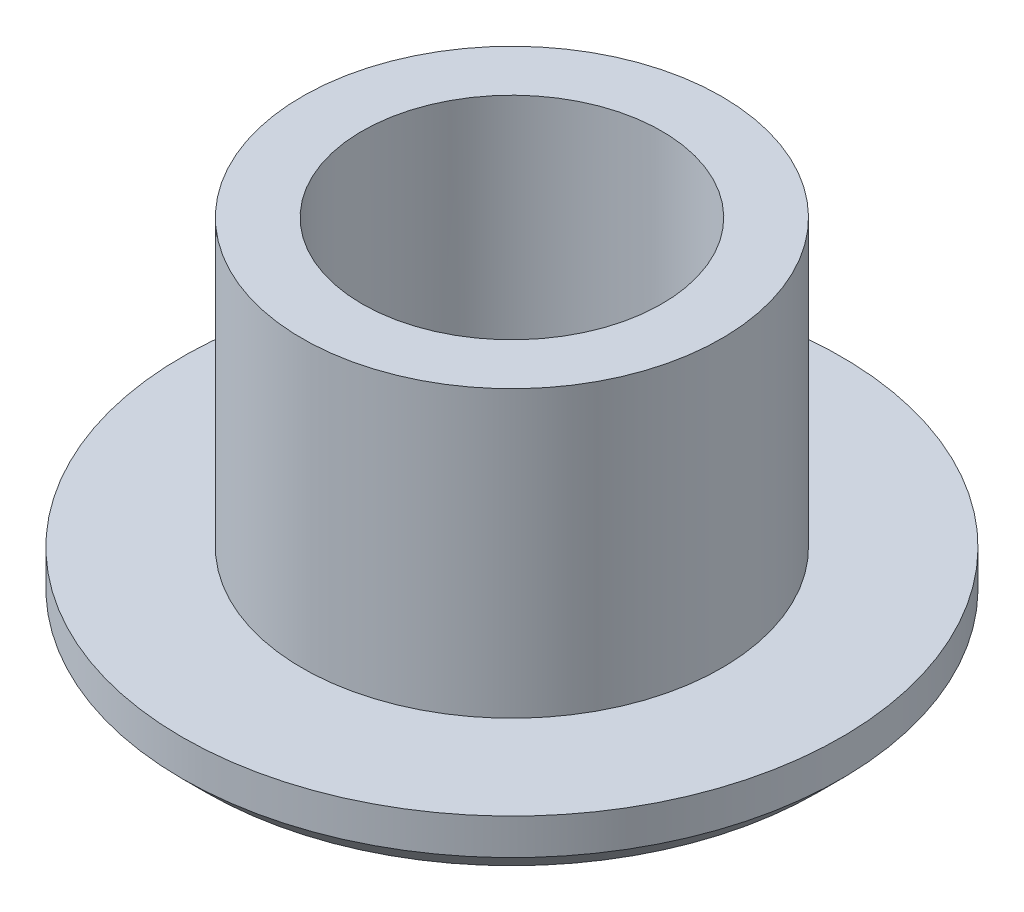
ISO-10303-21;
HEADER;
FILE_DESCRIPTION(('STEP AP214'),'2;1');
FILE_NAME('part.step','',(''),(''),'','','');
FILE_SCHEMA(('AUTOMOTIVE_DESIGN { 1 0 10303 214 1 1 1 1 }'));
ENDSEC;
DATA;
#1=APPLICATION_CONTEXT('core data for automotive mechanical design processes');
#2=APPLICATION_PROTOCOL_DEFINITION('international standard','automotive_design',2000,#1);
#3=PRODUCT_CONTEXT('',#1,'mechanical');
#4=PRODUCT('Part','Part','',(#3));
#5=PRODUCT_RELATED_PRODUCT_CATEGORY('part','',(#4));
#6=PRODUCT_DEFINITION_FORMATION('','',#4);
#7=PRODUCT_DEFINITION_CONTEXT('part definition',#1,'design');
#8=PRODUCT_DEFINITION('design','',#6,#7);
#9=PRODUCT_DEFINITION_SHAPE('','',#8);
#10=(LENGTH_UNIT() NAMED_UNIT(*) SI_UNIT(.MILLI.,.METRE.));
#11=(NAMED_UNIT(*) PLANE_ANGLE_UNIT() SI_UNIT($,.RADIAN.));
#12=(NAMED_UNIT(*) SI_UNIT($,.STERADIAN.) SOLID_ANGLE_UNIT());
#13=UNCERTAINTY_MEASURE_WITH_UNIT(LENGTH_MEASURE(1.E-05),#10,'distance_accuracy_value','');
#14=(GEOMETRIC_REPRESENTATION_CONTEXT(3) GLOBAL_UNCERTAINTY_ASSIGNED_CONTEXT((#13)) GLOBAL_UNIT_ASSIGNED_CONTEXT((#10,
#11,#12)) REPRESENTATION_CONTEXT('',''));
#15=CARTESIAN_POINT('',(0.,0.,0.));
#16=DIRECTION('',(0.,0.,1.));
#17=DIRECTION('',(1.,0.,0.));
#18=AXIS2_PLACEMENT_3D('',#15,#16,#17);
#19=CARTESIAN_POINT('',(0.,1.,0.));
#20=DIRECTION('',(0.,-1.,0.));
#21=DIRECTION('',(0.,0.,-1.));
#22=AXIS2_PLACEMENT_3D('',#19,#20,#21);
#23=CYLINDRICAL_SURFACE('',#22,5.5);
#24=CARTESIAN_POINT('',(0.,0.4,0.));
#25=DIRECTION('',(0.,1.,0.));
#26=DIRECTION('',(0.,0.,1.));
#27=AXIS2_PLACEMENT_3D('',#24,#25,#26);
#28=CIRCLE('',#27,5.5);
#29=CARTESIAN_POINT('',(0.,0.4,5.5));
#30=VERTEX_POINT('',#29);
#31=EDGE_CURVE('E51',#30,#30,#28,.T.);
#32=ORIENTED_EDGE('',*,*,#31,.T.);
#33=EDGE_LOOP('',(#32));
#34=FACE_BOUND('',#33,.T.);
#35=CARTESIAN_POINT('',(0.,1.,0.));
#36=DIRECTION('',(0.,1.,0.));
#37=DIRECTION('',(0.,0.,1.));
#38=AXIS2_PLACEMENT_3D('',#35,#36,#37);
#39=CIRCLE('',#38,5.5);
#40=CARTESIAN_POINT('',(0.,1.,5.5));
#41=VERTEX_POINT('',#40);
#42=EDGE_CURVE('E57',#41,#41,#39,.T.);
#43=ORIENTED_EDGE('',*,*,#42,.F.);
#44=EDGE_LOOP('',(#43));
#45=FACE_BOUND('',#44,.T.);
#46=ADVANCED_FACE('F35',(#34,#45),#23,.T.);
#47=CARTESIAN_POINT('',(0.,1.,0.));
#48=DIRECTION('',(0.,1.,0.));
#49=DIRECTION('',(0.,0.,1.));
#50=AXIS2_PLACEMENT_3D('',#47,#48,#49);
#51=PLANE('',#50);
#52=CARTESIAN_POINT('',(0.,1.,0.));
#53=DIRECTION('',(0.,1.,0.));
#54=DIRECTION('',(0.,0.,1.));
#55=AXIS2_PLACEMENT_3D('',#52,#53,#54);
#56=CIRCLE('',#55,3.5);
#57=CARTESIAN_POINT('',(0.,1.,-3.5));
#58=VERTEX_POINT('',#57);
#59=EDGE_CURVE('E56',#58,#58,#56,.T.);
#60=ORIENTED_EDGE('',*,*,#59,.F.);
#61=EDGE_LOOP('',(#60));
#62=FACE_BOUND('',#61,.T.);
#63=ORIENTED_EDGE('',*,*,#42,.T.);
#64=EDGE_LOOP('',(#63));
#65=FACE_BOUND('',#64,.T.);
#66=ADVANCED_FACE('F84',(#62,#65),#51,.T.);
#67=CARTESIAN_POINT('',(0.,0.,0.));
#68=DIRECTION('',(0.,1.,0.));
#69=DIRECTION('',(0.,0.,1.));
#70=AXIS2_PLACEMENT_3D('',#67,#68,#69);
#71=PLANE('',#70);
#72=CARTESIAN_POINT('',(0.,0.,0.));
#73=DIRECTION('',(0.,1.,0.));
#74=DIRECTION('',(0.,0.,1.));
#75=AXIS2_PLACEMENT_3D('',#72,#73,#74);
#76=CIRCLE('',#75,5.1);
#77=CARTESIAN_POINT('',(0.,0.,5.1));
#78=VERTEX_POINT('',#77);
#79=EDGE_CURVE('E43',#78,#78,#76,.F.);
#80=ORIENTED_EDGE('',*,*,#79,.T.);
#81=EDGE_LOOP('',(#80));
#82=FACE_BOUND('',#81,.T.);
#83=CARTESIAN_POINT('',(0.,0.,0.));
#84=DIRECTION('',(0.,1.,0.));
#85=DIRECTION('',(0.,0.,1.));
#86=AXIS2_PLACEMENT_3D('',#83,#84,#85);
#87=CIRCLE('',#86,2.9);
#88=CARTESIAN_POINT('',(0.,0.,-2.9));
#89=VERTEX_POINT('',#88);
#90=EDGE_CURVE('E47',#89,#89,#87,.T.);
#91=ORIENTED_EDGE('',*,*,#90,.T.);
#92=EDGE_LOOP('',(#91));
#93=FACE_BOUND('',#92,.T.);
#94=ADVANCED_FACE('F80',(#82,#93),#71,.F.);
#95=CARTESIAN_POINT('',(0.,5.7625,0.));
#96=DIRECTION('',(0.,-1.,0.));
#97=DIRECTION('',(0.,0.,-1.));
#98=AXIS2_PLACEMENT_3D('',#95,#96,#97);
#99=CYLINDRICAL_SURFACE('',#98,3.5);
#100=CARTESIAN_POINT('',(0.,5.7625,0.));
#101=DIRECTION('',(0.,1.,0.));
#102=DIRECTION('',(0.,0.,1.));
#103=AXIS2_PLACEMENT_3D('',#100,#101,#102);
#104=CIRCLE('',#103,3.5);
#105=CARTESIAN_POINT('',(0.,5.7625,-3.5));
#106=VERTEX_POINT('',#105);
#107=EDGE_CURVE('E60',#106,#106,#104,.T.);
#108=CARTESIAN_POINT('',(0.,5.7625,-3.5));
#109=CARTESIAN_POINT('',(0.,5.712890625,-3.5));
#110=CARTESIAN_POINT('',(0.,5.66328125,-3.5));
#111=CARTESIAN_POINT('',(0.,5.5640625,-3.5));
#112=CARTESIAN_POINT('',(0.,5.514453125,-3.5));
#113=CARTESIAN_POINT('',(0.,5.415234375,-3.5));
#114=CARTESIAN_POINT('',(0.,5.365625,-3.5));
#115=CARTESIAN_POINT('',(0.,5.26640625,-3.5));
#116=CARTESIAN_POINT('',(0.,5.216796875,-3.5));
#117=CARTESIAN_POINT('',(0.,5.117578125,-3.5));
#118=CARTESIAN_POINT('',(0.,5.06796875,-3.5));
#119=CARTESIAN_POINT('',(0.,4.96875,-3.5));
#120=CARTESIAN_POINT('',(0.,4.919140625,-3.5));
#121=CARTESIAN_POINT('',(0.,4.819921875,-3.5));
#122=CARTESIAN_POINT('',(0.,4.7703125,-3.5));
#123=CARTESIAN_POINT('',(0.,4.67109375,-3.5));
#124=CARTESIAN_POINT('',(0.,4.621484375,-3.5));
#125=CARTESIAN_POINT('',(0.,4.522265625,-3.5));
#126=CARTESIAN_POINT('',(0.,4.47265625,-3.5));
#127=CARTESIAN_POINT('',(0.,4.3734375,-3.5));
#128=CARTESIAN_POINT('',(0.,4.323828125,-3.5));
#129=CARTESIAN_POINT('',(0.,4.224609375,-3.5));
#130=CARTESIAN_POINT('',(0.,4.175,-3.5));
#131=CARTESIAN_POINT('',(0.,4.07578125,-3.5));
#132=CARTESIAN_POINT('',(0.,4.026171875,-3.5));
#133=CARTESIAN_POINT('',(0.,3.926953125,-3.5));
#134=CARTESIAN_POINT('',(0.,3.87734375,-3.5));
#135=CARTESIAN_POINT('',(0.,3.778125,-3.5));
#136=CARTESIAN_POINT('',(0.,3.728515625,-3.5));
#137=CARTESIAN_POINT('',(0.,3.629296875,-3.5));
#138=CARTESIAN_POINT('',(0.,3.5796875,-3.5));
#139=CARTESIAN_POINT('',(0.,3.48046875,-3.5));
#140=CARTESIAN_POINT('',(0.,3.430859375,-3.5));
#141=CARTESIAN_POINT('',(0.,3.331640625,-3.5));
#142=CARTESIAN_POINT('',(0.,3.28203125,-3.5));
#143=CARTESIAN_POINT('',(0.,3.1828125,-3.5));
#144=CARTESIAN_POINT('',(0.,3.133203125,-3.5));
#145=CARTESIAN_POINT('',(0.,3.033984375,-3.5));
#146=CARTESIAN_POINT('',(0.,2.984375,-3.5));
#147=CARTESIAN_POINT('',(0.,2.88515625,-3.5));
#148=CARTESIAN_POINT('',(0.,2.835546875,-3.5));
#149=CARTESIAN_POINT('',(0.,2.736328125,-3.5));
#150=CARTESIAN_POINT('',(0.,2.68671875,-3.5));
#151=CARTESIAN_POINT('',(0.,2.5875,-3.5));
#152=CARTESIAN_POINT('',(0.,2.537890625,-3.5));
#153=CARTESIAN_POINT('',(0.,2.438671875,-3.5));
#154=CARTESIAN_POINT('',(0.,2.3890625,-3.5));
#155=CARTESIAN_POINT('',(0.,2.28984375,-3.5));
#156=CARTESIAN_POINT('',(0.,2.240234375,-3.5));
#157=CARTESIAN_POINT('',(0.,2.141015625,-3.5));
#158=CARTESIAN_POINT('',(0.,2.09140625,-3.5));
#159=CARTESIAN_POINT('',(0.,1.9921875,-3.5));
#160=CARTESIAN_POINT('',(0.,1.942578125,-3.5));
#161=CARTESIAN_POINT('',(0.,1.843359375,-3.5));
#162=CARTESIAN_POINT('',(0.,1.79375,-3.5));
#163=CARTESIAN_POINT('',(0.,1.69453125,-3.5));
#164=CARTESIAN_POINT('',(0.,1.644921875,-3.5));
#165=CARTESIAN_POINT('',(0.,1.545703125,-3.5));
#166=CARTESIAN_POINT('',(0.,1.49609375,-3.5));
#167=CARTESIAN_POINT('',(0.,1.396875,-3.5));
#168=CARTESIAN_POINT('',(0.,1.347265625,-3.5));
#169=CARTESIAN_POINT('',(0.,1.248046875,-3.5));
#170=CARTESIAN_POINT('',(0.,1.1984375,-3.5));
#171=CARTESIAN_POINT('',(0.,1.09921875,-3.5));
#172=CARTESIAN_POINT('',(0.,1.049609375,-3.5));
#173=CARTESIAN_POINT('',(0.,1.,-3.5));
#174=B_SPLINE_CURVE_WITH_KNOTS('',3,(#108,#109,#110,#111,#112,#113,#114,#115,#116,#117,#118,
#119,#120,#121,#122,#123,#124,#125,#126,#127,#128,#129,#130,#131,#132,#133,#134,#135,#136,#137,
#138,#139,#140,#141,#142,#143,#144,#145,#146,#147,#148,#149,#150,#151,#152,#153,#154,#155,#156,
#157,#158,#159,#160,#161,#162,#163,#164,#165,#166,#167,#168,#169,#170,#171,#172,#173),
.UNSPECIFIED.,.F.,.F.,(4,2,2,2,2,2,2,2,2,2,2,2,2,2,2,2,2,2,2,2,2,2,2,2,2,2,2,2,2,2,2,2,4),(0.,
0.148828124999999,0.297656249999999,0.446484374999999,0.595312499999999,0.744140625,0.89296875,
1.041796875,1.190625,1.339453125,1.48828125,1.637109375,1.7859375,1.934765625,2.08359375,
2.232421875,2.38125,2.530078125,2.67890625,2.827734375,2.9765625,3.125390625,3.27421875,
3.423046875,3.571875,3.720703125,3.86953125,4.018359375,4.1671875,4.316015625,4.46484375,
4.613671875,4.7625),.UNSPECIFIED.);
#175=EDGE_CURVE('BSEAM74',#106,#58,#174,.T.);
#176=ORIENTED_EDGE('',*,*,#107,.F.);
#177=ORIENTED_EDGE('',*,*,#59,.T.);
#178=ORIENTED_EDGE('',*,*,#175,.T.);
#179=ORIENTED_EDGE('',*,*,#175,.F.);
#180=EDGE_LOOP('',(#176,#178,#177,#179));
#181=FACE_BOUND('',#180,.T.);
#182=ADVANCED_FACE('F74',(#181),#99,.T.);
#183=CARTESIAN_POINT('',(0.,5.7625,0.));
#184=DIRECTION('',(0.,1.,0.));
#185=DIRECTION('',(0.,0.,1.));
#186=AXIS2_PLACEMENT_3D('',#183,#184,#185);
#187=PLANE('',#186);
#188=CARTESIAN_POINT('',(0.,5.7625,0.));
#189=DIRECTION('',(0.,1.,0.));
#190=DIRECTION('',(0.,0.,1.));
#191=AXIS2_PLACEMENT_3D('',#188,#189,#190);
#192=CIRCLE('',#191,2.5);
#193=CARTESIAN_POINT('',(0.,5.7625,2.5));
#194=VERTEX_POINT('',#193);
#195=EDGE_CURVE('E65',#194,#194,#192,.T.);
#196=ORIENTED_EDGE('',*,*,#195,.F.);
#197=EDGE_LOOP('',(#196));
#198=FACE_BOUND('',#197,.T.);
#199=ORIENTED_EDGE('',*,*,#107,.T.);
#200=EDGE_LOOP('',(#199));
#201=FACE_BOUND('',#200,.T.);
#202=ADVANCED_FACE('F71',(#198,#201),#187,.T.);
#203=CARTESIAN_POINT('',(0.,0.,0.));
#204=DIRECTION('',(0.,1.,0.));
#205=DIRECTION('',(0.,0.,1.));
#206=AXIS2_PLACEMENT_3D('',#203,#204,#205);
#207=CYLINDRICAL_SURFACE('',#206,2.5);
#208=CARTESIAN_POINT('',(0.,0.399999999999999,0.));
#209=DIRECTION('',(0.,1.,0.));
#210=DIRECTION('',(0.,0.,1.));
#211=AXIS2_PLACEMENT_3D('',#208,#209,#210);
#212=CIRCLE('',#211,2.5);
#213=CARTESIAN_POINT('',(0.,0.399999999999999,-2.5));
#214=VERTEX_POINT('',#213);
#215=EDGE_CURVE('E10',#214,#214,#212,.F.);
#216=ORIENTED_EDGE('',*,*,#215,.T.);
#217=EDGE_LOOP('',(#216));
#218=FACE_BOUND('',#217,.T.);
#219=ORIENTED_EDGE('',*,*,#195,.T.);
#220=EDGE_LOOP('',(#219));
#221=FACE_BOUND('',#220,.T.);
#222=ADVANCED_FACE('F69',(#218,#221),#207,.F.);
#223=CARTESIAN_POINT('',(0.,0.4,0.));
#224=DIRECTION('',(0.,1.,0.));
#225=DIRECTION('',(0.,0.,1.));
#226=AXIS2_PLACEMENT_3D('',#223,#224,#225);
#227=CONICAL_SURFACE('',#226,5.5,0.78539816339745);
#228=ORIENTED_EDGE('',*,*,#79,.F.);
#229=EDGE_LOOP('',(#228));
#230=FACE_BOUND('',#229,.T.);
#231=ORIENTED_EDGE('',*,*,#31,.F.);
#232=EDGE_LOOP('',(#231));
#233=FACE_BOUND('',#232,.T.);
#234=ADVANCED_FACE('F97',(#230,#233),#227,.T.);
#235=CARTESIAN_POINT('',(0.,0.,0.));
#236=DIRECTION('',(0.,-1.,0.));
#237=DIRECTION('',(0.,0.,-1.));
#238=AXIS2_PLACEMENT_3D('',#235,#236,#237);
#239=CONICAL_SURFACE('',#238,2.9,0.785398163397447);
#240=CARTESIAN_POINT('',(0.,0.399999999999999,-2.5));
#241=CARTESIAN_POINT('',(0.,0.395833333333332,-2.50416666666667));
#242=CARTESIAN_POINT('',(0.,0.391666666666666,-2.50833333333333));
#243=CARTESIAN_POINT('',(0.,0.383333333333332,-2.51666666666667));
#244=CARTESIAN_POINT('',(0.,0.379166666666666,-2.52083333333333));
#245=CARTESIAN_POINT('',(0.,0.370833333333332,-2.52916666666667));
#246=CARTESIAN_POINT('',(0.,0.366666666666666,-2.53333333333333));
#247=CARTESIAN_POINT('',(0.,0.358333333333332,-2.54166666666667));
#248=CARTESIAN_POINT('',(0.,0.354166666666666,-2.54583333333333));
#249=CARTESIAN_POINT('',(0.,0.345833333333332,-2.55416666666667));
#250=CARTESIAN_POINT('',(0.,0.341666666666666,-2.55833333333333));
#251=CARTESIAN_POINT('',(0.,0.333333333333332,-2.56666666666667));
#252=CARTESIAN_POINT('',(0.,0.329166666666666,-2.57083333333333));
#253=CARTESIAN_POINT('',(0.,0.320833333333332,-2.57916666666667));
#254=CARTESIAN_POINT('',(0.,0.316666666666666,-2.58333333333333));
#255=CARTESIAN_POINT('',(0.,0.308333333333333,-2.59166666666667));
#256=CARTESIAN_POINT('',(0.,0.304166666666666,-2.59583333333333));
#257=CARTESIAN_POINT('',(0.,0.295833333333333,-2.60416666666667));
#258=CARTESIAN_POINT('',(0.,0.291666666666666,-2.60833333333333));
#259=CARTESIAN_POINT('',(0.,0.283333333333333,-2.61666666666667));
#260=CARTESIAN_POINT('',(0.,0.279166666666666,-2.62083333333333));
#261=CARTESIAN_POINT('',(0.,0.270833333333333,-2.62916666666667));
#262=CARTESIAN_POINT('',(0.,0.266666666666666,-2.63333333333333));
#263=CARTESIAN_POINT('',(0.,0.258333333333333,-2.64166666666667));
#264=CARTESIAN_POINT('',(0.,0.254166666666666,-2.64583333333333));
#265=CARTESIAN_POINT('',(0.,0.245833333333333,-2.65416666666667));
#266=CARTESIAN_POINT('',(0.,0.241666666666666,-2.65833333333333));
#267=CARTESIAN_POINT('',(0.,0.233333333333333,-2.66666666666667));
#268=CARTESIAN_POINT('',(0.,0.229166666666666,-2.67083333333333));
#269=CARTESIAN_POINT('',(0.,0.220833333333333,-2.67916666666667));
#270=CARTESIAN_POINT('',(0.,0.216666666666666,-2.68333333333333));
#271=CARTESIAN_POINT('',(0.,0.208333333333333,-2.69166666666667));
#272=CARTESIAN_POINT('',(0.,0.204166666666666,-2.69583333333333));
#273=CARTESIAN_POINT('',(0.,0.195833333333333,-2.70416666666667));
#274=CARTESIAN_POINT('',(0.,0.191666666666666,-2.70833333333333));
#275=CARTESIAN_POINT('',(0.,0.183333333333333,-2.71666666666667));
#276=CARTESIAN_POINT('',(0.,0.179166666666666,-2.72083333333333));
#277=CARTESIAN_POINT('',(0.,0.170833333333333,-2.72916666666667));
#278=CARTESIAN_POINT('',(0.,0.166666666666666,-2.73333333333333));
#279=CARTESIAN_POINT('',(0.,0.158333333333333,-2.74166666666667));
#280=CARTESIAN_POINT('',(0.,0.154166666666666,-2.74583333333333));
#281=CARTESIAN_POINT('',(0.,0.145833333333333,-2.75416666666667));
#282=CARTESIAN_POINT('',(0.,0.141666666666666,-2.75833333333333));
#283=CARTESIAN_POINT('',(0.,0.133333333333333,-2.76666666666667));
#284=CARTESIAN_POINT('',(0.,0.129166666666666,-2.77083333333333));
#285=CARTESIAN_POINT('',(0.,0.120833333333333,-2.77916666666667));
#286=CARTESIAN_POINT('',(0.,0.116666666666666,-2.78333333333333));
#287=CARTESIAN_POINT('',(0.,0.108333333333333,-2.79166666666667));
#288=CARTESIAN_POINT('',(0.,0.104166666666666,-2.79583333333333));
#289=CARTESIAN_POINT('',(0.,0.0958333333333331,-2.80416666666667));
#290=CARTESIAN_POINT('',(0.,0.0916666666666664,-2.80833333333333));
#291=CARTESIAN_POINT('',(0.,0.0833333333333331,-2.81666666666667));
#292=CARTESIAN_POINT('',(0.,0.0791666666666665,-2.82083333333333));
#293=CARTESIAN_POINT('',(0.,0.0708333333333332,-2.82916666666667));
#294=CARTESIAN_POINT('',(0.,0.0666666666666665,-2.83333333333333));
#295=CARTESIAN_POINT('',(0.,0.0583333333333332,-2.84166666666667));
#296=CARTESIAN_POINT('',(0.,0.0541666666666665,-2.84583333333333));
#297=CARTESIAN_POINT('',(0.,0.0458333333333332,-2.85416666666667));
#298=CARTESIAN_POINT('',(0.,0.0416666666666665,-2.85833333333333));
#299=CARTESIAN_POINT('',(0.,0.0333333333333332,-2.86666666666666));
#300=CARTESIAN_POINT('',(0.,0.0291666666666666,-2.87083333333333));
#301=CARTESIAN_POINT('',(0.,0.0208333333333333,-2.87916666666666));
#302=CARTESIAN_POINT('',(0.,0.0166666666666666,-2.88333333333333));
#303=CARTESIAN_POINT('',(0.,0.00833333333333332,-2.89166666666666));
#304=CARTESIAN_POINT('',(0.,0.00416666666666665,-2.89583333333333));
#305=CARTESIAN_POINT('',(0.,0.,-2.9));
#306=B_SPLINE_CURVE_WITH_KNOTS('',3,(#240,#241,#242,#243,#244,#245,#246,#247,#248,#249,#250,
#251,#252,#253,#254,#255,#256,#257,#258,#259,#260,#261,#262,#263,#264,#265,#266,#267,#268,#269,
#270,#271,#272,#273,#274,#275,#276,#277,#278,#279,#280,#281,#282,#283,#284,#285,#286,#287,#288,
#289,#290,#291,#292,#293,#294,#295,#296,#297,#298,#299,#300,#301,#302,#303,#304,#305),
.UNSPECIFIED.,.F.,.F.,(4,2,2,2,2,2,2,2,2,2,2,2,2,2,2,2,2,2,2,2,2,2,2,2,2,2,2,2,2,2,2,2,4),(0.,
0.0176776695296636,0.0353553390593272,0.0530330085889908,0.0707106781186544,0.0883883476483181,
0.106066017177982,0.123743686707645,0.141421356237309,0.159099025766973,0.176776695296636,
0.1944543648263,0.212132034355963,0.229809703885627,0.247487373415291,0.265165042944954,
0.282842712474618,0.300520382004281,0.318198051533945,0.335875721063609,0.353553390593273,
0.371231060122936,0.3889087296526,0.406586399182263,0.424264068711927,0.441941738241591,
0.459619407771254,0.477297077300918,0.494974746830581,0.512652416360245,0.530330085889909,
0.548007755419572,0.565685424949236),.UNSPECIFIED.);
#307=EDGE_CURVE('BSEAM38',#214,#89,#306,.T.);
#308=ORIENTED_EDGE('',*,*,#215,.F.);
#309=ORIENTED_EDGE('',*,*,#90,.F.);
#310=ORIENTED_EDGE('',*,*,#307,.T.);
#311=ORIENTED_EDGE('',*,*,#307,.F.);
#312=EDGE_LOOP('',(#308,#310,#309,#311));
#313=FACE_BOUND('',#312,.T.);
#314=ADVANCED_FACE('F38',(#313),#239,.F.);
#315=CLOSED_SHELL('',(#46,#66,#94,#182,#202,#222,#234,#314));
#316=MANIFOLD_SOLID_BREP('B2',#315);
#317=ADVANCED_BREP_SHAPE_REPRESENTATION('',(#18,#316),#14);
#318=SHAPE_DEFINITION_REPRESENTATION(#9,#317);
ENDSEC;
END-ISO-10303-21;
